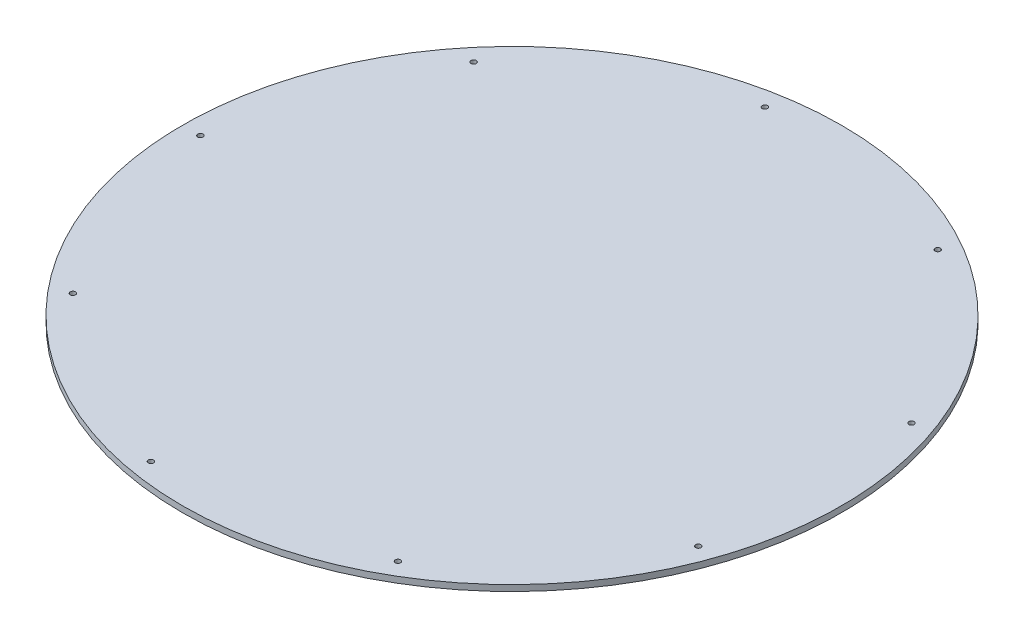
ISO-10303-21;
HEADER;
FILE_DESCRIPTION(('STEP AP214'),'2;1');
FILE_NAME('part.step','',(''),(''),'','','');
FILE_SCHEMA(('AUTOMOTIVE_DESIGN { 1 0 10303 214 1 1 1 1 }'));
ENDSEC;
DATA;
#1=APPLICATION_CONTEXT('core data for automotive mechanical design processes');
#2=APPLICATION_PROTOCOL_DEFINITION('international standard','automotive_design',2000,#1);
#3=PRODUCT_CONTEXT('',#1,'mechanical');
#4=PRODUCT('Part','Part','',(#3));
#5=PRODUCT_RELATED_PRODUCT_CATEGORY('part','',(#4));
#6=PRODUCT_DEFINITION_FORMATION('','',#4);
#7=PRODUCT_DEFINITION_CONTEXT('part definition',#1,'design');
#8=PRODUCT_DEFINITION('design','',#6,#7);
#9=PRODUCT_DEFINITION_SHAPE('','',#8);
#10=(LENGTH_UNIT() NAMED_UNIT(*) SI_UNIT(.MILLI.,.METRE.));
#11=(NAMED_UNIT(*) PLANE_ANGLE_UNIT() SI_UNIT($,.RADIAN.));
#12=(NAMED_UNIT(*) SI_UNIT($,.STERADIAN.) SOLID_ANGLE_UNIT());
#13=UNCERTAINTY_MEASURE_WITH_UNIT(LENGTH_MEASURE(1.E-05),#10,'distance_accuracy_value','');
#14=(GEOMETRIC_REPRESENTATION_CONTEXT(3) GLOBAL_UNCERTAINTY_ASSIGNED_CONTEXT((#13)) GLOBAL_UNIT_ASSIGNED_CONTEXT((#10,
#11,#12)) REPRESENTATION_CONTEXT('',''));
#15=CARTESIAN_POINT('',(0.,0.,0.));
#16=DIRECTION('',(0.,0.,1.));
#17=DIRECTION('',(1.,0.,0.));
#18=AXIS2_PLACEMENT_3D('',#15,#16,#17);
#19=CARTESIAN_POINT('',(0.,5.842,0.));
#20=DIRECTION('',(0.,-1.,0.));
#21=DIRECTION('',(0.,0.,-1.));
#22=AXIS2_PLACEMENT_3D('',#19,#20,#21);
#23=CYLINDRICAL_SURFACE('',#22,318.262);
#24=CARTESIAN_POINT('',(0.,5.842,0.));
#25=DIRECTION('',(0.,1.,0.));
#26=DIRECTION('',(0.,0.,1.));
#27=AXIS2_PLACEMENT_3D('',#24,#25,#26);
#28=CIRCLE('',#27,318.262);
#29=CARTESIAN_POINT('',(0.,5.842,318.262));
#30=VERTEX_POINT('',#29);
#31=EDGE_CURVE('E10',#30,#30,#28,.T.);
#32=ORIENTED_EDGE('',*,*,#31,.F.);
#33=EDGE_LOOP('',(#32));
#34=FACE_BOUND('',#33,.T.);
#35=CARTESIAN_POINT('',(0.,0.,0.));
#36=DIRECTION('',(0.,1.,0.));
#37=DIRECTION('',(0.,0.,1.));
#38=AXIS2_PLACEMENT_3D('',#35,#36,#37);
#39=CIRCLE('',#38,318.262);
#40=CARTESIAN_POINT('',(0.,0.,318.262));
#41=VERTEX_POINT('',#40);
#42=EDGE_CURVE('E33',#41,#41,#39,.T.);
#43=ORIENTED_EDGE('',*,*,#42,.T.);
#44=EDGE_LOOP('',(#43));
#45=FACE_BOUND('',#44,.T.);
#46=ADVANCED_FACE('F30',(#34,#45),#23,.T.);
#47=CARTESIAN_POINT('',(0.,5.842,0.));
#48=DIRECTION('',(0.,1.,0.));
#49=DIRECTION('',(0.,0.,1.));
#50=AXIS2_PLACEMENT_3D('',#47,#48,#49);
#51=PLANE('',#50);
#52=CARTESIAN_POINT('',(-230.571716934384,5.842,193.472642639549));
#53=DIRECTION('',(0.,1.,0.));
#54=DIRECTION('',(0.64278760968653,0.,0.766044443118986));
#55=AXIS2_PLACEMENT_3D('',#52,#53,#54);
#56=CIRCLE('',#55,2.55270000000004);
#57=CARTESIAN_POINT('',(-228.930873003137,5.842,195.428124289499));
#58=VERTEX_POINT('',#57);
#59=EDGE_CURVE('E54',#58,#58,#56,.T.);
#60=ORIENTED_EDGE('',*,*,#59,.F.);
#61=EDGE_LOOP('',(#60));
#62=FACE_BOUND('',#61,.T.);
#63=CARTESIAN_POINT('',(-52.2663649959724,5.842,296.417285579144));
#64=DIRECTION('',(0.,1.,0.));
#65=DIRECTION('',(0.984807753012206,0.,0.17364817766694));
#66=AXIS2_PLACEMENT_3D('',#63,#64,#65);
#67=CIRCLE('',#66,2.55270000000004);
#68=CARTESIAN_POINT('',(-49.7524462448581,5.842,296.860557282274));
#69=VERTEX_POINT('',#68);
#70=EDGE_CURVE('E60',#69,#69,#67,.T.);
#71=ORIENTED_EDGE('',*,*,#70,.F.);
#72=EDGE_LOOP('',(#71));
#73=FACE_BOUND('',#72,.T.);
#74=CARTESIAN_POINT('',(150.494999999998,5.842,260.66498628508));
#75=DIRECTION('',(0.,1.,0.));
#76=DIRECTION('',(0.866025403784443,0.,-0.499999999999992));
#77=AXIS2_PLACEMENT_3D('',#74,#75,#76);
#78=CIRCLE('',#77,2.55270000000004);
#79=CARTESIAN_POINT('',(152.705703048238,5.842,259.38863628508));
#80=VERTEX_POINT('',#79);
#81=EDGE_CURVE('E66',#80,#80,#78,.T.);
#82=ORIENTED_EDGE('',*,*,#81,.F.);
#83=EDGE_LOOP('',(#82));
#84=FACE_BOUND('',#83,.T.);
#85=CARTESIAN_POINT('',(282.83808193035,5.842,102.944642939595));
#86=DIRECTION('',(0.,1.,0.));
#87=DIRECTION('',(0.342020143325676,0.,-0.939692620785906));
#88=AXIS2_PLACEMENT_3D('',#85,#86,#87);
#89=CIRCLE('',#88,2.55270000000004);
#90=CARTESIAN_POINT('',(283.711156750217,5.842,100.545889586515));
#91=VERTEX_POINT('',#90);
#92=EDGE_CURVE('E72',#91,#91,#89,.T.);
#93=ORIENTED_EDGE('',*,*,#92,.F.);
#94=EDGE_LOOP('',(#93));
#95=FACE_BOUND('',#94,.T.);
#96=CARTESIAN_POINT('',(282.838081930351,5.842,-102.944642939591));
#97=DIRECTION('',(0.,1.,0.));
#98=DIRECTION('',(-0.342020143325663,0.,-0.939692620785911));
#99=AXIS2_PLACEMENT_3D('',#96,#97,#98);
#100=CIRCLE('',#99,2.55270000000004);
#101=CARTESIAN_POINT('',(281.965007110484,5.842,-105.343396292672));
#102=VERTEX_POINT('',#101);
#103=EDGE_CURVE('E78',#102,#102,#100,.T.);
#104=ORIENTED_EDGE('',*,*,#103,.F.);
#105=EDGE_LOOP('',(#104));
#106=FACE_BOUND('',#105,.T.);
#107=CARTESIAN_POINT('',(150.495000000001,5.842,-260.664986285078));
#108=DIRECTION('',(0.,1.,0.));
#109=DIRECTION('',(-0.866025403784436,0.,-0.500000000000004));
#110=AXIS2_PLACEMENT_3D('',#107,#108,#109);
#111=CIRCLE('',#110,2.55270000000004);
#112=CARTESIAN_POINT('',(148.284296951761,5.842,-261.941336285078));
#113=VERTEX_POINT('',#112);
#114=EDGE_CURVE('E84',#113,#113,#111,.T.);
#115=ORIENTED_EDGE('',*,*,#114,.F.);
#116=EDGE_LOOP('',(#115));
#117=FACE_BOUND('',#116,.T.);
#118=CARTESIAN_POINT('',(-52.2663649959685,5.842,-296.417285579145));
#119=DIRECTION('',(0.,1.,0.));
#120=DIRECTION('',(-0.984807753012209,0.,0.173648177666927));
#121=AXIS2_PLACEMENT_3D('',#118,#119,#120);
#122=CIRCLE('',#121,2.55270000000004);
#123=CARTESIAN_POINT('',(-54.7802837470828,5.842,-295.974013876014));
#124=VERTEX_POINT('',#123);
#125=EDGE_CURVE('E90',#124,#124,#122,.T.);
#126=ORIENTED_EDGE('',*,*,#125,.F.);
#127=EDGE_LOOP('',(#126));
#128=FACE_BOUND('',#127,.T.);
#129=CARTESIAN_POINT('',(-230.571716934381,5.842,-193.472642639552));
#130=DIRECTION('',(0.,1.,0.));
#131=DIRECTION('',(-0.642787609686541,0.,0.766044443118977));
#132=AXIS2_PLACEMENT_3D('',#129,#130,#131);
#133=CIRCLE('',#132,2.55270000000004);
#134=CARTESIAN_POINT('',(-232.212560865628,5.842,-191.517160989602));
#135=VERTEX_POINT('',#134);
#136=EDGE_CURVE('E48',#135,#135,#133,.T.);
#137=ORIENTED_EDGE('',*,*,#136,.F.);
#138=EDGE_LOOP('',(#137));
#139=FACE_BOUND('',#138,.T.);
#140=CARTESIAN_POINT('',(-300.99,5.842,0.));
#141=DIRECTION('',(0.,1.,0.));
#142=DIRECTION('',(0.,0.,1.));
#143=AXIS2_PLACEMENT_3D('',#140,#141,#142);
#144=CIRCLE('',#143,2.55270000000004);
#145=CARTESIAN_POINT('',(-300.99,5.842,2.55270000000008));
#146=VERTEX_POINT('',#145);
#147=EDGE_CURVE('E42',#146,#146,#144,.T.);
#148=ORIENTED_EDGE('',*,*,#147,.F.);
#149=EDGE_LOOP('',(#148));
#150=FACE_BOUND('',#149,.T.);
#151=ORIENTED_EDGE('',*,*,#31,.T.);
#152=EDGE_LOOP('',(#151));
#153=FACE_BOUND('',#152,.T.);
#154=ADVANCED_FACE('F107',(#62,#73,#84,#95,#106,#117,#128,#139,#150,#153),#51,.T.);
#155=CARTESIAN_POINT('',(0.,0.,0.));
#156=DIRECTION('',(0.,1.,0.));
#157=DIRECTION('',(0.,0.,1.));
#158=AXIS2_PLACEMENT_3D('',#155,#156,#157);
#159=PLANE('',#158);
#160=CARTESIAN_POINT('',(-230.571716934384,0.,193.472642639549));
#161=DIRECTION('',(0.,1.,0.));
#162=DIRECTION('',(0.64278760968653,0.,0.766044443118986));
#163=AXIS2_PLACEMENT_3D('',#160,#161,#162);
#164=CIRCLE('',#163,2.55270000000004);
#165=CARTESIAN_POINT('',(-228.930873003137,0.,195.428124289499));
#166=VERTEX_POINT('',#165);
#167=EDGE_CURVE('E57',#166,#166,#164,.T.);
#168=ORIENTED_EDGE('',*,*,#167,.T.);
#169=EDGE_LOOP('',(#168));
#170=FACE_BOUND('',#169,.T.);
#171=CARTESIAN_POINT('',(-52.2663649959724,0.,296.417285579144));
#172=DIRECTION('',(0.,1.,0.));
#173=DIRECTION('',(0.984807753012206,0.,0.17364817766694));
#174=AXIS2_PLACEMENT_3D('',#171,#172,#173);
#175=CIRCLE('',#174,2.55270000000004);
#176=CARTESIAN_POINT('',(-49.7524462448581,0.,296.860557282274));
#177=VERTEX_POINT('',#176);
#178=EDGE_CURVE('E63',#177,#177,#175,.T.);
#179=ORIENTED_EDGE('',*,*,#178,.T.);
#180=EDGE_LOOP('',(#179));
#181=FACE_BOUND('',#180,.T.);
#182=CARTESIAN_POINT('',(150.494999999998,0.,260.66498628508));
#183=DIRECTION('',(0.,1.,0.));
#184=DIRECTION('',(0.866025403784443,0.,-0.499999999999992));
#185=AXIS2_PLACEMENT_3D('',#182,#183,#184);
#186=CIRCLE('',#185,2.55270000000004);
#187=CARTESIAN_POINT('',(152.705703048238,0.,259.38863628508));
#188=VERTEX_POINT('',#187);
#189=EDGE_CURVE('E69',#188,#188,#186,.T.);
#190=ORIENTED_EDGE('',*,*,#189,.T.);
#191=EDGE_LOOP('',(#190));
#192=FACE_BOUND('',#191,.T.);
#193=CARTESIAN_POINT('',(282.83808193035,0.,102.944642939595));
#194=DIRECTION('',(0.,1.,0.));
#195=DIRECTION('',(0.342020143325676,0.,-0.939692620785906));
#196=AXIS2_PLACEMENT_3D('',#193,#194,#195);
#197=CIRCLE('',#196,2.55270000000004);
#198=CARTESIAN_POINT('',(283.711156750217,0.,100.545889586515));
#199=VERTEX_POINT('',#198);
#200=EDGE_CURVE('E75',#199,#199,#197,.T.);
#201=ORIENTED_EDGE('',*,*,#200,.T.);
#202=EDGE_LOOP('',(#201));
#203=FACE_BOUND('',#202,.T.);
#204=CARTESIAN_POINT('',(282.838081930351,0.,-102.944642939591));
#205=DIRECTION('',(0.,1.,0.));
#206=DIRECTION('',(-0.342020143325663,0.,-0.939692620785911));
#207=AXIS2_PLACEMENT_3D('',#204,#205,#206);
#208=CIRCLE('',#207,2.55270000000004);
#209=CARTESIAN_POINT('',(281.965007110484,0.,-105.343396292672));
#210=VERTEX_POINT('',#209);
#211=EDGE_CURVE('E81',#210,#210,#208,.T.);
#212=ORIENTED_EDGE('',*,*,#211,.T.);
#213=EDGE_LOOP('',(#212));
#214=FACE_BOUND('',#213,.T.);
#215=CARTESIAN_POINT('',(150.495000000001,0.,-260.664986285078));
#216=DIRECTION('',(0.,1.,0.));
#217=DIRECTION('',(-0.866025403784436,0.,-0.500000000000004));
#218=AXIS2_PLACEMENT_3D('',#215,#216,#217);
#219=CIRCLE('',#218,2.55270000000004);
#220=CARTESIAN_POINT('',(148.284296951761,0.,-261.941336285078));
#221=VERTEX_POINT('',#220);
#222=EDGE_CURVE('E87',#221,#221,#219,.T.);
#223=ORIENTED_EDGE('',*,*,#222,.T.);
#224=EDGE_LOOP('',(#223));
#225=FACE_BOUND('',#224,.T.);
#226=CARTESIAN_POINT('',(-52.2663649959685,0.,-296.417285579145));
#227=DIRECTION('',(0.,1.,0.));
#228=DIRECTION('',(-0.984807753012209,0.,0.173648177666927));
#229=AXIS2_PLACEMENT_3D('',#226,#227,#228);
#230=CIRCLE('',#229,2.55270000000004);
#231=CARTESIAN_POINT('',(-54.7802837470828,0.,-295.974013876014));
#232=VERTEX_POINT('',#231);
#233=EDGE_CURVE('E51',#232,#232,#230,.T.);
#234=ORIENTED_EDGE('',*,*,#233,.T.);
#235=EDGE_LOOP('',(#234));
#236=FACE_BOUND('',#235,.T.);
#237=CARTESIAN_POINT('',(-230.571716934381,0.,-193.472642639552));
#238=DIRECTION('',(0.,1.,0.));
#239=DIRECTION('',(-0.642787609686541,0.,0.766044443118977));
#240=AXIS2_PLACEMENT_3D('',#237,#238,#239);
#241=CIRCLE('',#240,2.55270000000004);
#242=CARTESIAN_POINT('',(-232.212560865628,0.,-191.517160989602));
#243=VERTEX_POINT('',#242);
#244=EDGE_CURVE('E45',#243,#243,#241,.T.);
#245=ORIENTED_EDGE('',*,*,#244,.T.);
#246=EDGE_LOOP('',(#245));
#247=FACE_BOUND('',#246,.T.);
#248=CARTESIAN_POINT('',(-300.99,0.,0.));
#249=DIRECTION('',(0.,1.,0.));
#250=DIRECTION('',(0.,0.,1.));
#251=AXIS2_PLACEMENT_3D('',#248,#249,#250);
#252=CIRCLE('',#251,2.55270000000004);
#253=CARTESIAN_POINT('',(-300.99,0.,2.55270000000008));
#254=VERTEX_POINT('',#253);
#255=EDGE_CURVE('E40',#254,#254,#252,.T.);
#256=ORIENTED_EDGE('',*,*,#255,.T.);
#257=EDGE_LOOP('',(#256));
#258=FACE_BOUND('',#257,.T.);
#259=ORIENTED_EDGE('',*,*,#42,.F.);
#260=EDGE_LOOP('',(#259));
#261=FACE_BOUND('',#260,.T.);
#262=ADVANCED_FACE('F96',(#170,#181,#192,#203,#214,#225,#236,#247,#258,#261),#159,.F.);
#263=CARTESIAN_POINT('',(-300.99,0.,0.));
#264=DIRECTION('',(0.,1.,0.));
#265=DIRECTION('',(0.,0.,1.));
#266=AXIS2_PLACEMENT_3D('',#263,#264,#265);
#267=CYLINDRICAL_SURFACE('',#266,2.55270000000004);
#268=ORIENTED_EDGE('',*,*,#255,.F.);
#269=EDGE_LOOP('',(#268));
#270=FACE_BOUND('',#269,.T.);
#271=ORIENTED_EDGE('',*,*,#147,.T.);
#272=EDGE_LOOP('',(#271));
#273=FACE_BOUND('',#272,.T.);
#274=ADVANCED_FACE('F116',(#270,#273),#267,.F.);
#275=CARTESIAN_POINT('',(-230.571716934381,0.,-193.472642639552));
#276=DIRECTION('',(0.,1.,0.));
#277=DIRECTION('',(0.,0.,1.));
#278=AXIS2_PLACEMENT_3D('',#275,#276,#277);
#279=CYLINDRICAL_SURFACE('',#278,2.55270000000004);
#280=ORIENTED_EDGE('',*,*,#244,.F.);
#281=EDGE_LOOP('',(#280));
#282=FACE_BOUND('',#281,.T.);
#283=ORIENTED_EDGE('',*,*,#136,.T.);
#284=EDGE_LOOP('',(#283));
#285=FACE_BOUND('',#284,.T.);
#286=ADVANCED_FACE('F103',(#282,#285),#279,.F.);
#287=CARTESIAN_POINT('',(-52.2663649959685,0.,-296.417285579145));
#288=DIRECTION('',(0.,1.,0.));
#289=DIRECTION('',(0.,0.,1.));
#290=AXIS2_PLACEMENT_3D('',#287,#288,#289);
#291=CYLINDRICAL_SURFACE('',#290,2.55270000000004);
#292=ORIENTED_EDGE('',*,*,#233,.F.);
#293=EDGE_LOOP('',(#292));
#294=FACE_BOUND('',#293,.T.);
#295=ORIENTED_EDGE('',*,*,#125,.T.);
#296=EDGE_LOOP('',(#295));
#297=FACE_BOUND('',#296,.T.);
#298=ADVANCED_FACE('F99',(#294,#297),#291,.F.);
#299=CARTESIAN_POINT('',(150.495000000001,0.,-260.664986285078));
#300=DIRECTION('',(0.,1.,0.));
#301=DIRECTION('',(0.,0.,1.));
#302=AXIS2_PLACEMENT_3D('',#299,#300,#301);
#303=CYLINDRICAL_SURFACE('',#302,2.55270000000004);
#304=ORIENTED_EDGE('',*,*,#222,.F.);
#305=EDGE_LOOP('',(#304));
#306=FACE_BOUND('',#305,.T.);
#307=ORIENTED_EDGE('',*,*,#114,.T.);
#308=EDGE_LOOP('',(#307));
#309=FACE_BOUND('',#308,.T.);
#310=ADVANCED_FACE('F102',(#306,#309),#303,.F.);
#311=CARTESIAN_POINT('',(282.838081930351,0.,-102.944642939591));
#312=DIRECTION('',(0.,1.,0.));
#313=DIRECTION('',(0.,0.,1.));
#314=AXIS2_PLACEMENT_3D('',#311,#312,#313);
#315=CYLINDRICAL_SURFACE('',#314,2.55270000000004);
#316=ORIENTED_EDGE('',*,*,#211,.F.);
#317=EDGE_LOOP('',(#316));
#318=FACE_BOUND('',#317,.T.);
#319=ORIENTED_EDGE('',*,*,#103,.T.);
#320=EDGE_LOOP('',(#319));
#321=FACE_BOUND('',#320,.T.);
#322=ADVANCED_FACE('F165',(#318,#321),#315,.F.);
#323=CARTESIAN_POINT('',(282.83808193035,0.,102.944642939595));
#324=DIRECTION('',(0.,1.,0.));
#325=DIRECTION('',(0.,0.,1.));
#326=AXIS2_PLACEMENT_3D('',#323,#324,#325);
#327=CYLINDRICAL_SURFACE('',#326,2.55270000000004);
#328=ORIENTED_EDGE('',*,*,#200,.F.);
#329=EDGE_LOOP('',(#328));
#330=FACE_BOUND('',#329,.T.);
#331=ORIENTED_EDGE('',*,*,#92,.T.);
#332=EDGE_LOOP('',(#331));
#333=FACE_BOUND('',#332,.T.);
#334=ADVANCED_FACE('F175',(#330,#333),#327,.F.);
#335=CARTESIAN_POINT('',(150.494999999998,0.,260.66498628508));
#336=DIRECTION('',(0.,1.,0.));
#337=DIRECTION('',(0.,0.,1.));
#338=AXIS2_PLACEMENT_3D('',#335,#336,#337);
#339=CYLINDRICAL_SURFACE('',#338,2.55270000000004);
#340=ORIENTED_EDGE('',*,*,#189,.F.);
#341=EDGE_LOOP('',(#340));
#342=FACE_BOUND('',#341,.T.);
#343=ORIENTED_EDGE('',*,*,#81,.T.);
#344=EDGE_LOOP('',(#343));
#345=FACE_BOUND('',#344,.T.);
#346=ADVANCED_FACE('F185',(#342,#345),#339,.F.);
#347=CARTESIAN_POINT('',(-52.2663649959724,0.,296.417285579144));
#348=DIRECTION('',(0.,1.,0.));
#349=DIRECTION('',(0.,0.,1.));
#350=AXIS2_PLACEMENT_3D('',#347,#348,#349);
#351=CYLINDRICAL_SURFACE('',#350,2.55270000000004);
#352=ORIENTED_EDGE('',*,*,#178,.F.);
#353=EDGE_LOOP('',(#352));
#354=FACE_BOUND('',#353,.T.);
#355=ORIENTED_EDGE('',*,*,#70,.T.);
#356=EDGE_LOOP('',(#355));
#357=FACE_BOUND('',#356,.T.);
#358=ADVANCED_FACE('F195',(#354,#357),#351,.F.);
#359=CARTESIAN_POINT('',(-230.571716934384,0.,193.472642639549));
#360=DIRECTION('',(0.,1.,0.));
#361=DIRECTION('',(0.,0.,1.));
#362=AXIS2_PLACEMENT_3D('',#359,#360,#361);
#363=CYLINDRICAL_SURFACE('',#362,2.55270000000004);
#364=ORIENTED_EDGE('',*,*,#167,.F.);
#365=EDGE_LOOP('',(#364));
#366=FACE_BOUND('',#365,.T.);
#367=ORIENTED_EDGE('',*,*,#59,.T.);
#368=EDGE_LOOP('',(#367));
#369=FACE_BOUND('',#368,.T.);
#370=ADVANCED_FACE('F205',(#366,#369),#363,.F.);
#371=CLOSED_SHELL('',(#46,#154,#262,#274,#286,#298,#310,#322,#334,#346,#358,#370));
#372=MANIFOLD_SOLID_BREP('B2',#371);
#373=ADVANCED_BREP_SHAPE_REPRESENTATION('',(#18,#372),#14);
#374=SHAPE_DEFINITION_REPRESENTATION(#9,#373);
ENDSEC;
END-ISO-10303-21;
